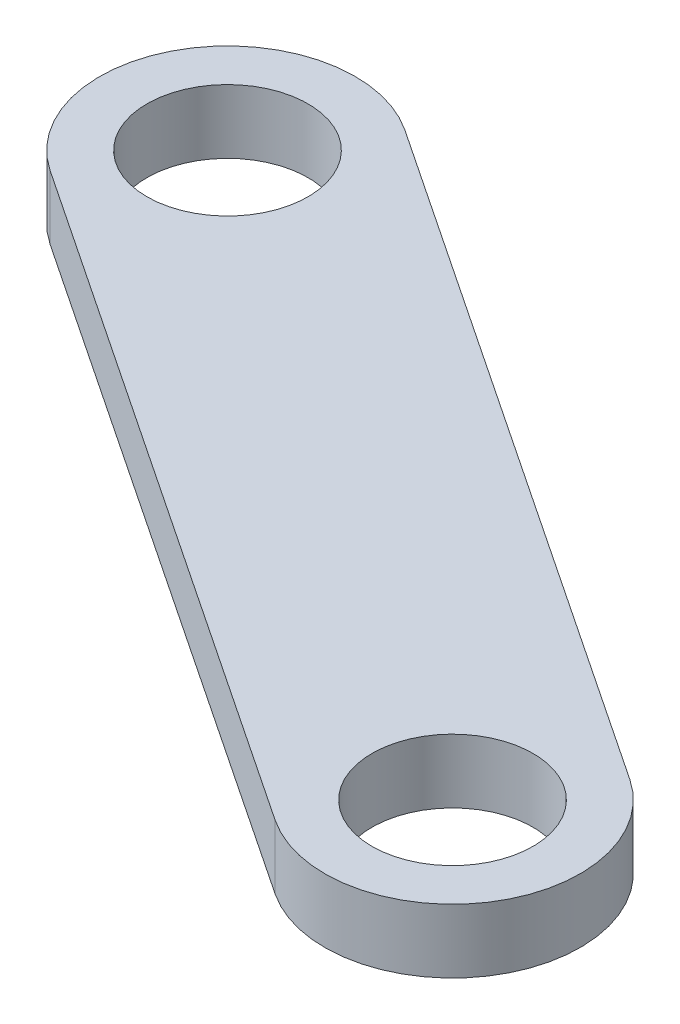
ISO-10303-21;
HEADER;
FILE_DESCRIPTION(('STEP AP214'),'2;1');
FILE_NAME('part.step','',(''),(''),'','','');
FILE_SCHEMA(('AUTOMOTIVE_DESIGN { 1 0 10303 214 1 1 1 1 }'));
ENDSEC;
DATA;
#1=APPLICATION_CONTEXT('core data for automotive mechanical design processes');
#2=APPLICATION_PROTOCOL_DEFINITION('international standard','automotive_design',2000,#1);
#3=PRODUCT_CONTEXT('',#1,'mechanical');
#4=PRODUCT('Part','Part','',(#3));
#5=PRODUCT_RELATED_PRODUCT_CATEGORY('part','',(#4));
#6=PRODUCT_DEFINITION_FORMATION('','',#4);
#7=PRODUCT_DEFINITION_CONTEXT('part definition',#1,'design');
#8=PRODUCT_DEFINITION('design','',#6,#7);
#9=PRODUCT_DEFINITION_SHAPE('','',#8);
#10=(LENGTH_UNIT() NAMED_UNIT(*) SI_UNIT(.MILLI.,.METRE.));
#11=(NAMED_UNIT(*) PLANE_ANGLE_UNIT() SI_UNIT($,.RADIAN.));
#12=(NAMED_UNIT(*) SI_UNIT($,.STERADIAN.) SOLID_ANGLE_UNIT());
#13=UNCERTAINTY_MEASURE_WITH_UNIT(LENGTH_MEASURE(1.E-05),#10,'distance_accuracy_value','');
#14=(GEOMETRIC_REPRESENTATION_CONTEXT(3) GLOBAL_UNCERTAINTY_ASSIGNED_CONTEXT((#13)) GLOBAL_UNIT_ASSIGNED_CONTEXT((#10,
#11,#12)) REPRESENTATION_CONTEXT('',''));
#15=CARTESIAN_POINT('',(0.,0.,0.));
#16=DIRECTION('',(0.,0.,1.));
#17=DIRECTION('',(1.,0.,0.));
#18=AXIS2_PLACEMENT_3D('',#15,#16,#17);
#19=CARTESIAN_POINT('',(16.764,1.5875,11.176));
#20=DIRECTION('',(0.,-1.,0.));
#21=DIRECTION('',(0.,0.,-1.));
#22=AXIS2_PLACEMENT_3D('',#19,#20,#21);
#23=PLANE('',#22);
#24=CARTESIAN_POINT('',(16.764,1.5875,11.176));
#25=DIRECTION('',(0.,1.,0.));
#26=DIRECTION('',(0.,0.,-1.));
#27=AXIS2_PLACEMENT_3D('',#24,#25,#26);
#28=CIRCLE('',#27,3.175);
#29=CARTESIAN_POINT('',(15.0028268769849,1.5875,13.8177596845227));
#30=VERTEX_POINT('',#29);
#31=CARTESIAN_POINT('',(18.5251731230151,1.5875,8.53424031547735));
#32=VERTEX_POINT('',#31);
#33=EDGE_CURVE('E92',#30,#32,#28,.T.);
#34=ORIENTED_EDGE('',*,*,#33,.T.);
#35=DIRECTION('',(-0.832050294337844,0.,-0.554700196225229));
#36=VECTOR('',#35,1.);
#37=CARTESIAN_POINT('',(18.5251731230151,1.5875,8.53424031547735));
#38=LINE('',#37,#36);
#39=CARTESIAN_POINT('',(1.7611731230151,1.5875,-2.64175968452265));
#40=VERTEX_POINT('',#39);
#41=EDGE_CURVE('E87',#32,#40,#38,.T.);
#42=ORIENTED_EDGE('',*,*,#41,.T.);
#43=CARTESIAN_POINT('',(0.,1.5875,0.));
#44=DIRECTION('',(0.,1.,0.));
#45=DIRECTION('',(0.,0.,-1.));
#46=AXIS2_PLACEMENT_3D('',#43,#44,#45);
#47=CIRCLE('',#46,3.175);
#48=CARTESIAN_POINT('',(-1.7611731230151,1.5875,2.64175968452265));
#49=VERTEX_POINT('',#48);
#50=EDGE_CURVE('E90',#40,#49,#47,.T.);
#51=ORIENTED_EDGE('',*,*,#50,.T.);
#52=DIRECTION('',(0.832050294337844,0.,0.554700196225229));
#53=VECTOR('',#52,1.);
#54=CARTESIAN_POINT('',(15.0028268769849,1.5875,13.8177596845227));
#55=LINE('',#54,#53);
#56=EDGE_CURVE('E57',#49,#30,#55,.T.);
#57=ORIENTED_EDGE('',*,*,#56,.T.);
#58=EDGE_LOOP('',(#34,#42,#51,#57));
#59=FACE_BOUND('',#58,.T.);
#60=CARTESIAN_POINT('',(0.,1.5875,0.));
#61=DIRECTION('',(0.,1.,0.));
#62=DIRECTION('',(0.,0.,1.));
#63=AXIS2_PLACEMENT_3D('',#60,#61,#62);
#64=CIRCLE('',#63,2.);
#65=CARTESIAN_POINT('',(0.,1.5875,2.));
#66=VERTEX_POINT('',#65);
#67=EDGE_CURVE('E112',#66,#66,#64,.T.);
#68=ORIENTED_EDGE('',*,*,#67,.F.);
#69=EDGE_LOOP('',(#68));
#70=FACE_BOUND('',#69,.T.);
#71=CARTESIAN_POINT('',(16.764,1.5875,11.176));
#72=DIRECTION('',(0.,1.,0.));
#73=DIRECTION('',(0.,0.,1.));
#74=AXIS2_PLACEMENT_3D('',#71,#72,#73);
#75=CIRCLE('',#74,2.);
#76=CARTESIAN_POINT('',(16.764,1.5875,13.176));
#77=VERTEX_POINT('',#76);
#78=EDGE_CURVE('E134',#77,#77,#75,.T.);
#79=ORIENTED_EDGE('',*,*,#78,.F.);
#80=EDGE_LOOP('',(#79));
#81=FACE_BOUND('',#80,.T.);
#82=ADVANCED_FACE('F39',(#59,#70,#81),#23,.F.);
#83=CARTESIAN_POINT('',(16.764,0.,11.176));
#84=DIRECTION('',(0.,-1.,0.));
#85=DIRECTION('',(0.,0.,-1.));
#86=AXIS2_PLACEMENT_3D('',#83,#84,#85);
#87=PLANE('',#86);
#88=CARTESIAN_POINT('',(0.,0.,0.));
#89=DIRECTION('',(0.,1.,0.));
#90=DIRECTION('',(0.,0.,1.));
#91=AXIS2_PLACEMENT_3D('',#88,#89,#90);
#92=CIRCLE('',#91,2.);
#93=CARTESIAN_POINT('',(0.,0.,2.));
#94=VERTEX_POINT('',#93);
#95=EDGE_CURVE('E130',#94,#94,#92,.T.);
#96=ORIENTED_EDGE('',*,*,#95,.T.);
#97=EDGE_LOOP('',(#96));
#98=FACE_BOUND('',#97,.T.);
#99=CARTESIAN_POINT('',(16.764,0.,11.176));
#100=DIRECTION('',(0.,1.,0.));
#101=DIRECTION('',(0.,0.,-1.));
#102=AXIS2_PLACEMENT_3D('',#99,#100,#101);
#103=CIRCLE('',#102,3.175);
#104=CARTESIAN_POINT('',(15.0028268769849,0.,13.8177596845227));
#105=VERTEX_POINT('',#104);
#106=CARTESIAN_POINT('',(18.5251731230151,0.,8.53424031547735));
#107=VERTEX_POINT('',#106);
#108=EDGE_CURVE('E108',#105,#107,#103,.T.);
#109=ORIENTED_EDGE('',*,*,#108,.F.);
#110=DIRECTION('',(0.832050294337844,0.,0.554700196225229));
#111=VECTOR('',#110,1.);
#112=CARTESIAN_POINT('',(15.0028268769849,0.,13.8177596845227));
#113=LINE('',#112,#111);
#114=CARTESIAN_POINT('',(-1.7611731230151,0.,2.64175968452265));
#115=VERTEX_POINT('',#114);
#116=EDGE_CURVE('E80',#115,#105,#113,.T.);
#117=ORIENTED_EDGE('',*,*,#116,.F.);
#118=CARTESIAN_POINT('',(0.,0.,0.));
#119=DIRECTION('',(0.,1.,0.));
#120=DIRECTION('',(0.,0.,-1.));
#121=AXIS2_PLACEMENT_3D('',#118,#119,#120);
#122=CIRCLE('',#121,3.175);
#123=CARTESIAN_POINT('',(1.7611731230151,0.,-2.64175968452265));
#124=VERTEX_POINT('',#123);
#125=EDGE_CURVE('E74',#124,#115,#122,.T.);
#126=ORIENTED_EDGE('',*,*,#125,.F.);
#127=DIRECTION('',(-0.832050294337844,0.,-0.554700196225229));
#128=VECTOR('',#127,1.);
#129=CARTESIAN_POINT('',(18.5251731230151,0.,8.53424031547735));
#130=LINE('',#129,#128);
#131=EDGE_CURVE('E97',#107,#124,#130,.T.);
#132=ORIENTED_EDGE('',*,*,#131,.F.);
#133=EDGE_LOOP('',(#109,#117,#126,#132));
#134=FACE_BOUND('',#133,.T.);
#135=CARTESIAN_POINT('',(16.764,0.,11.176));
#136=DIRECTION('',(0.,1.,0.));
#137=DIRECTION('',(0.,0.,1.));
#138=AXIS2_PLACEMENT_3D('',#135,#136,#137);
#139=CIRCLE('',#138,2.);
#140=CARTESIAN_POINT('',(16.764,0.,13.176));
#141=VERTEX_POINT('',#140);
#142=EDGE_CURVE('E138',#141,#141,#139,.T.);
#143=ORIENTED_EDGE('',*,*,#142,.T.);
#144=EDGE_LOOP('',(#143));
#145=FACE_BOUND('',#144,.T.);
#146=ADVANCED_FACE('F125',(#98,#134,#145),#87,.T.);
#147=CARTESIAN_POINT('',(16.764,1.5875,11.176));
#148=DIRECTION('',(0.,-1.,0.));
#149=DIRECTION('',(0.,0.,-1.));
#150=AXIS2_PLACEMENT_3D('',#147,#148,#149);
#151=CYLINDRICAL_SURFACE('',#150,3.175);
#152=ORIENTED_EDGE('',*,*,#108,.T.);
#153=DIRECTION('',(0.,-1.,0.));
#154=VECTOR('',#153,1.);
#155=CARTESIAN_POINT('',(18.5251731230151,1.5875,8.53424031547735));
#156=LINE('',#155,#154);
#157=EDGE_CURVE('E11',#32,#107,#156,.T.);
#158=ORIENTED_EDGE('',*,*,#157,.F.);
#159=ORIENTED_EDGE('',*,*,#33,.F.);
#160=DIRECTION('',(0.,-1.,0.));
#161=VECTOR('',#160,1.);
#162=CARTESIAN_POINT('',(15.0028268769849,1.5875,13.8177596845227));
#163=LINE('',#162,#161);
#164=EDGE_CURVE('E104',#30,#105,#163,.T.);
#165=ORIENTED_EDGE('',*,*,#164,.T.);
#166=EDGE_LOOP('',(#152,#158,#159,#165));
#167=FACE_BOUND('',#166,.T.);
#168=ADVANCED_FACE('F41',(#167),#151,.T.);
#169=CARTESIAN_POINT('',(18.5251731230151,1.5875,8.53424031547735));
#170=DIRECTION('',(-0.554700196225229,0.,0.832050294337844));
#171=DIRECTION('',(0.832050294337844,0.,0.554700196225229));
#172=AXIS2_PLACEMENT_3D('',#169,#170,#171);
#173=PLANE('',#172);
#174=ORIENTED_EDGE('',*,*,#131,.T.);
#175=DIRECTION('',(0.,-1.,0.));
#176=VECTOR('',#175,1.);
#177=CARTESIAN_POINT('',(1.7611731230151,1.5875,-2.64175968452265));
#178=LINE('',#177,#176);
#179=EDGE_CURVE('E49',#40,#124,#178,.T.);
#180=ORIENTED_EDGE('',*,*,#179,.F.);
#181=ORIENTED_EDGE('',*,*,#41,.F.);
#182=ORIENTED_EDGE('',*,*,#157,.T.);
#183=EDGE_LOOP('',(#174,#180,#181,#182));
#184=FACE_BOUND('',#183,.T.);
#185=ADVANCED_FACE('F96',(#184),#173,.F.);
#186=CARTESIAN_POINT('',(0.,1.5875,0.));
#187=DIRECTION('',(0.,-1.,0.));
#188=DIRECTION('',(0.,0.,-1.));
#189=AXIS2_PLACEMENT_3D('',#186,#187,#188);
#190=CYLINDRICAL_SURFACE('',#189,3.175);
#191=ORIENTED_EDGE('',*,*,#125,.T.);
#192=DIRECTION('',(0.,-1.,0.));
#193=VECTOR('',#192,1.);
#194=CARTESIAN_POINT('',(-1.7611731230151,1.5875,2.64175968452265));
#195=LINE('',#194,#193);
#196=EDGE_CURVE('E99',#49,#115,#195,.T.);
#197=ORIENTED_EDGE('',*,*,#196,.F.);
#198=ORIENTED_EDGE('',*,*,#50,.F.);
#199=ORIENTED_EDGE('',*,*,#179,.T.);
#200=EDGE_LOOP('',(#191,#197,#198,#199));
#201=FACE_BOUND('',#200,.T.);
#202=ADVANCED_FACE('F100',(#201),#190,.T.);
#203=CARTESIAN_POINT('',(15.0028268769849,1.5875,13.8177596845227));
#204=DIRECTION('',(0.554700196225229,0.,-0.832050294337844));
#205=DIRECTION('',(-0.832050294337844,0.,-0.554700196225229));
#206=AXIS2_PLACEMENT_3D('',#203,#204,#205);
#207=PLANE('',#206);
#208=ORIENTED_EDGE('',*,*,#116,.T.);
#209=ORIENTED_EDGE('',*,*,#164,.F.);
#210=ORIENTED_EDGE('',*,*,#56,.F.);
#211=ORIENTED_EDGE('',*,*,#196,.T.);
#212=EDGE_LOOP('',(#208,#209,#210,#211));
#213=FACE_BOUND('',#212,.T.);
#214=ADVANCED_FACE('F122',(#213),#207,.F.);
#215=CARTESIAN_POINT('',(0.,1.5875,0.));
#216=DIRECTION('',(0.,-1.,0.));
#217=DIRECTION('',(0.,0.,-1.));
#218=AXIS2_PLACEMENT_3D('',#215,#216,#217);
#219=CYLINDRICAL_SURFACE('',#218,2.);
#220=ORIENTED_EDGE('',*,*,#67,.T.);
#221=EDGE_LOOP('',(#220));
#222=FACE_BOUND('',#221,.T.);
#223=ORIENTED_EDGE('',*,*,#95,.F.);
#224=EDGE_LOOP('',(#223));
#225=FACE_BOUND('',#224,.T.);
#226=ADVANCED_FACE('F157',(#222,#225),#219,.F.);
#227=CARTESIAN_POINT('',(16.764,1.5875,11.176));
#228=DIRECTION('',(0.,-1.,0.));
#229=DIRECTION('',(0.,0.,-1.));
#230=AXIS2_PLACEMENT_3D('',#227,#228,#229);
#231=CYLINDRICAL_SURFACE('',#230,2.);
#232=ORIENTED_EDGE('',*,*,#78,.T.);
#233=EDGE_LOOP('',(#232));
#234=FACE_BOUND('',#233,.T.);
#235=ORIENTED_EDGE('',*,*,#142,.F.);
#236=EDGE_LOOP('',(#235));
#237=FACE_BOUND('',#236,.T.);
#238=ADVANCED_FACE('F146',(#234,#237),#231,.F.);
#239=CLOSED_SHELL('',(#82,#146,#168,#185,#202,#214,#226,#238));
#240=MANIFOLD_SOLID_BREP('B2',#239);
#241=ADVANCED_BREP_SHAPE_REPRESENTATION('',(#18,#240),#14);
#242=SHAPE_DEFINITION_REPRESENTATION(#9,#241);
ENDSEC;
END-ISO-10303-21;
